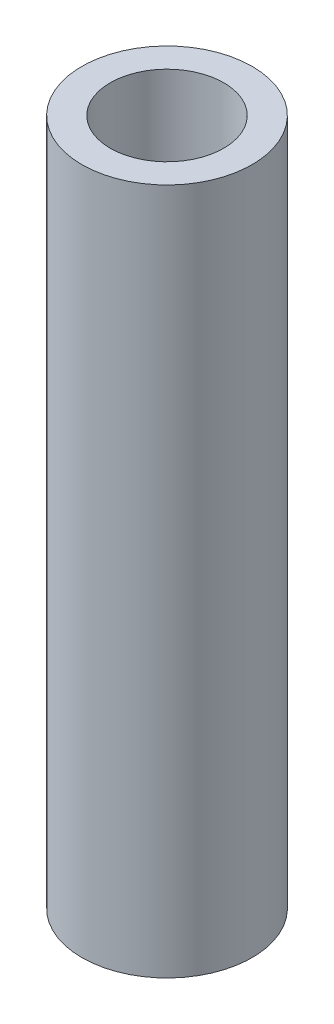
ISO-10303-21;
HEADER;
FILE_DESCRIPTION(('STEP AP214'),'2;1');
FILE_NAME('part.step','',(''),(''),'','','');
FILE_SCHEMA(('AUTOMOTIVE_DESIGN { 1 0 10303 214 1 1 1 1 }'));
ENDSEC;
DATA;
#1=APPLICATION_CONTEXT('core data for automotive mechanical design processes');
#2=APPLICATION_PROTOCOL_DEFINITION('international standard','automotive_design',2000,#1);
#3=PRODUCT_CONTEXT('',#1,'mechanical');
#4=PRODUCT('Part','Part','',(#3));
#5=PRODUCT_RELATED_PRODUCT_CATEGORY('part','',(#4));
#6=PRODUCT_DEFINITION_FORMATION('','',#4);
#7=PRODUCT_DEFINITION_CONTEXT('part definition',#1,'design');
#8=PRODUCT_DEFINITION('design','',#6,#7);
#9=PRODUCT_DEFINITION_SHAPE('','',#8);
#10=(LENGTH_UNIT() NAMED_UNIT(*) SI_UNIT(.MILLI.,.METRE.));
#11=(NAMED_UNIT(*) PLANE_ANGLE_UNIT() SI_UNIT($,.RADIAN.));
#12=(NAMED_UNIT(*) SI_UNIT($,.STERADIAN.) SOLID_ANGLE_UNIT());
#13=UNCERTAINTY_MEASURE_WITH_UNIT(LENGTH_MEASURE(1.E-05),#10,'distance_accuracy_value','');
#14=(GEOMETRIC_REPRESENTATION_CONTEXT(3) GLOBAL_UNCERTAINTY_ASSIGNED_CONTEXT((#13)) GLOBAL_UNIT_ASSIGNED_CONTEXT((#10,
#11,#12)) REPRESENTATION_CONTEXT('',''));
#15=CARTESIAN_POINT('',(0.,0.,0.));
#16=DIRECTION('',(0.,0.,1.));
#17=DIRECTION('',(1.,0.,0.));
#18=AXIS2_PLACEMENT_3D('',#15,#16,#17);
#19=CARTESIAN_POINT('',(0.,60.5,0.));
#20=DIRECTION('',(0.,1.,0.));
#21=DIRECTION('',(0.,0.,1.));
#22=AXIS2_PLACEMENT_3D('',#19,#20,#21);
#23=PLANE('',#22);
#24=CARTESIAN_POINT('',(0.,60.5,0.));
#25=DIRECTION('',(0.,1.,0.));
#26=DIRECTION('',(0.,0.,1.));
#27=AXIS2_PLACEMENT_3D('',#24,#25,#26);
#28=CIRCLE('',#27,7.5);
#29=CARTESIAN_POINT('',(0.,60.5,7.5));
#30=VERTEX_POINT('',#29);
#31=EDGE_CURVE('E10',#30,#30,#28,.T.);
#32=ORIENTED_EDGE('',*,*,#31,.T.);
#33=EDGE_LOOP('',(#32));
#34=FACE_BOUND('',#33,.T.);
#35=CARTESIAN_POINT('',(0.,60.5,0.));
#36=DIRECTION('',(0.,1.,0.));
#37=DIRECTION('',(0.,0.,1.));
#38=AXIS2_PLACEMENT_3D('',#35,#36,#37);
#39=CIRCLE('',#38,5.);
#40=CARTESIAN_POINT('',(0.,60.5,5.));
#41=VERTEX_POINT('',#40);
#42=EDGE_CURVE('E50',#41,#41,#39,.T.);
#43=ORIENTED_EDGE('',*,*,#42,.F.);
#44=EDGE_LOOP('',(#43));
#45=FACE_BOUND('',#44,.T.);
#46=ADVANCED_FACE('F37',(#34,#45),#23,.T.);
#47=CARTESIAN_POINT('',(0.,0.,0.));
#48=DIRECTION('',(0.,1.,0.));
#49=DIRECTION('',(0.,0.,1.));
#50=AXIS2_PLACEMENT_3D('',#47,#48,#49);
#51=PLANE('',#50);
#52=CARTESIAN_POINT('',(0.,0.,0.));
#53=DIRECTION('',(0.,1.,0.));
#54=DIRECTION('',(0.,0.,1.));
#55=AXIS2_PLACEMENT_3D('',#52,#53,#54);
#56=CIRCLE('',#55,7.5);
#57=CARTESIAN_POINT('',(0.,0.,7.5));
#58=VERTEX_POINT('',#57);
#59=EDGE_CURVE('E41',#58,#58,#56,.T.);
#60=ORIENTED_EDGE('',*,*,#59,.F.);
#61=EDGE_LOOP('',(#60));
#62=FACE_BOUND('',#61,.T.);
#63=CARTESIAN_POINT('',(0.,0.,0.));
#64=DIRECTION('',(0.,1.,0.));
#65=DIRECTION('',(0.,0.,1.));
#66=AXIS2_PLACEMENT_3D('',#63,#64,#65);
#67=CIRCLE('',#66,5.);
#68=CARTESIAN_POINT('',(0.,0.,5.));
#69=VERTEX_POINT('',#68);
#70=EDGE_CURVE('E52',#69,#69,#67,.T.);
#71=ORIENTED_EDGE('',*,*,#70,.T.);
#72=EDGE_LOOP('',(#71));
#73=FACE_BOUND('',#72,.T.);
#74=ADVANCED_FACE('F64',(#62,#73),#51,.F.);
#75=CARTESIAN_POINT('',(0.,60.5,0.));
#76=DIRECTION('',(0.,-1.,0.));
#77=DIRECTION('',(0.,0.,-1.));
#78=AXIS2_PLACEMENT_3D('',#75,#76,#77);
#79=CYLINDRICAL_SURFACE('',#78,7.5);
#80=ORIENTED_EDGE('',*,*,#31,.F.);
#81=EDGE_LOOP('',(#80));
#82=FACE_BOUND('',#81,.T.);
#83=ORIENTED_EDGE('',*,*,#59,.T.);
#84=EDGE_LOOP('',(#83));
#85=FACE_BOUND('',#84,.T.);
#86=ADVANCED_FACE('F39',(#82,#85),#79,.T.);
#87=CARTESIAN_POINT('',(0.,60.5,0.));
#88=DIRECTION('',(0.,-1.,0.));
#89=DIRECTION('',(0.,0.,-1.));
#90=AXIS2_PLACEMENT_3D('',#87,#88,#89);
#91=CYLINDRICAL_SURFACE('',#90,5.);
#92=ORIENTED_EDGE('',*,*,#42,.T.);
#93=EDGE_LOOP('',(#92));
#94=FACE_BOUND('',#93,.T.);
#95=ORIENTED_EDGE('',*,*,#70,.F.);
#96=EDGE_LOOP('',(#95));
#97=FACE_BOUND('',#96,.T.);
#98=ADVANCED_FACE('F60',(#94,#97),#91,.F.);
#99=CLOSED_SHELL('',(#46,#74,#86,#98));
#100=MANIFOLD_SOLID_BREP('B2',#99);
#101=ADVANCED_BREP_SHAPE_REPRESENTATION('',(#18,#100),#14);
#102=SHAPE_DEFINITION_REPRESENTATION(#9,#101);
ENDSEC;
END-ISO-10303-21;
